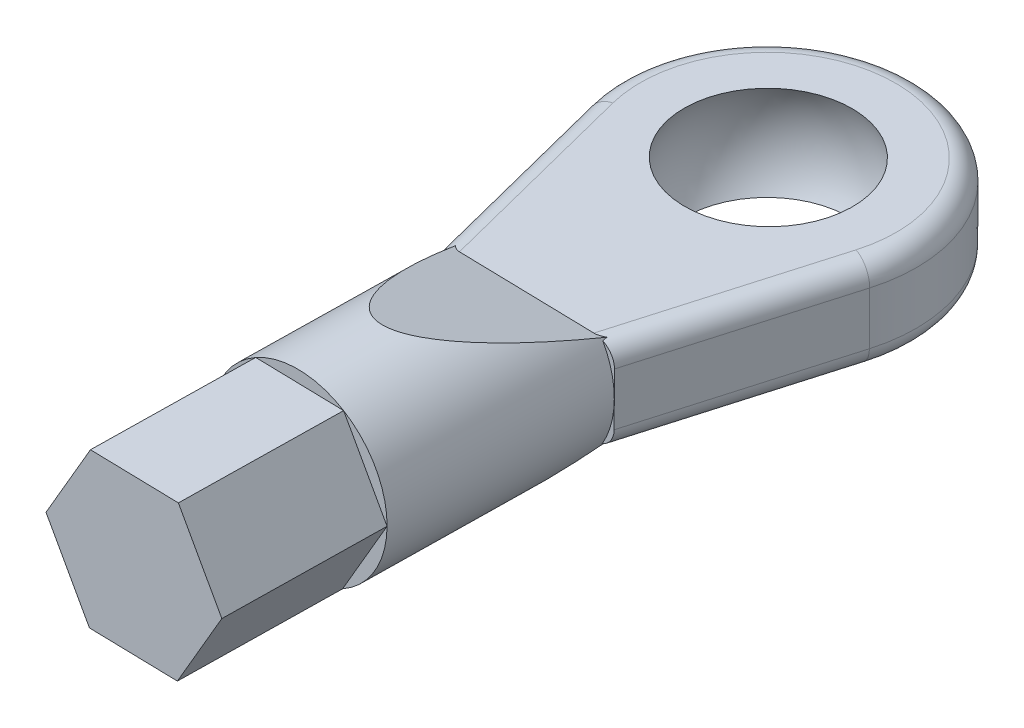
ISO-10303-21;
HEADER;
FILE_DESCRIPTION(('STEP AP214'),'2;1');
FILE_NAME('part.step','',(''),(''),'','','');
FILE_SCHEMA(('AUTOMOTIVE_DESIGN { 1 0 10303 214 1 1 1 1 }'));
ENDSEC;
DATA;
#1=APPLICATION_CONTEXT('core data for automotive mechanical design processes');
#2=APPLICATION_PROTOCOL_DEFINITION('international standard','automotive_design',2000,#1);
#3=PRODUCT_CONTEXT('',#1,'mechanical');
#4=PRODUCT('Part','Part','',(#3));
#5=PRODUCT_RELATED_PRODUCT_CATEGORY('part','',(#4));
#6=PRODUCT_DEFINITION_FORMATION('','',#4);
#7=PRODUCT_DEFINITION_CONTEXT('part definition',#1,'design');
#8=PRODUCT_DEFINITION('design','',#6,#7);
#9=PRODUCT_DEFINITION_SHAPE('','',#8);
#10=(LENGTH_UNIT() NAMED_UNIT(*) SI_UNIT(.MILLI.,.METRE.));
#11=(NAMED_UNIT(*) PLANE_ANGLE_UNIT() SI_UNIT($,.RADIAN.));
#12=(NAMED_UNIT(*) SI_UNIT($,.STERADIAN.) SOLID_ANGLE_UNIT());
#13=UNCERTAINTY_MEASURE_WITH_UNIT(LENGTH_MEASURE(1.E-05),#10,'distance_accuracy_value','');
#14=(GEOMETRIC_REPRESENTATION_CONTEXT(3) GLOBAL_UNCERTAINTY_ASSIGNED_CONTEXT((#13)) GLOBAL_UNIT_ASSIGNED_CONTEXT((#10,
#11,#12)) REPRESENTATION_CONTEXT('',''));
#15=CARTESIAN_POINT('',(0.,0.,0.));
#16=DIRECTION('',(0.,0.,1.));
#17=DIRECTION('',(1.,0.,0.));
#18=AXIS2_PLACEMENT_3D('',#15,#16,#17);
#19=CARTESIAN_POINT('',(5.67601321239481,0.292668026914246,-41.74833254457));
#20=DIRECTION('',(-0.0165938332906445,0.,0.999862312869488));
#21=DIRECTION('',(0.999840533761555,-0.00660028329978561,0.0165934718419906));
#22=AXIS2_PLACEMENT_3D('',#19,#20,#21);
#23=SPHERICAL_SURFACE('',#22,2.35);
#24=CARTESIAN_POINT('',(5.67601321239481,0.292668026914246,-41.74833254457));
#25=DIRECTION('',(0.00659937452571779,0.999978217892951,0.000109524000729846));
#26=DIRECTION('',(-0.0165938332906445,0.,0.999862312869488));
#27=AXIS2_PLACEMENT_3D('',#24,#25,#26);
#28=SPHERICAL_SURFACE('',#27,2.35);
#29=CARTESIAN_POINT('',(5.66814234326676,-0.899974950577202,-41.7484631704457));
#30=DIRECTION('',(0.00659937452571778,0.999978217892951,0.000109524000729846));
#31=DIRECTION('',(-0.0165938332906445,0.,0.999862312869488));
#32=AXIS2_PLACEMENT_3D('',#29,#30,#31);
#33=CIRCLE('',#32,2.0248557382185);
#34=CARTESIAN_POINT('',(5.63454222470916,-0.899974950577167,-39.7238862288035));
#35=VERTEX_POINT('',#34);
#36=EDGE_CURVE('E11',#35,#35,#33,.T.);
#37=ORIENTED_EDGE('',*,*,#36,.F.);
#38=EDGE_LOOP('',(#37));
#39=FACE_BOUND('',#38,.T.);
#40=CARTESIAN_POINT('',(5.68332090467591,1.39997495057659,-41.748211265244));
#41=DIRECTION('',(-0.00659937452571778,-0.999978217892951,-0.000109524000729846));
#42=DIRECTION('',(0.0165938332906445,0.,-0.999862312869488));
#43=AXIS2_PLACEMENT_3D('',#40,#41,#42);
#44=CIRCLE('',#43,2.07275612644958);
#45=CARTESIAN_POINT('',(5.71771587429038,1.39997495057655,-43.8206819998502));
#46=VERTEX_POINT('',#45);
#47=EDGE_CURVE('E23',#46,#46,#44,.T.);
#48=ORIENTED_EDGE('',*,*,#47,.F.);
#49=EDGE_LOOP('',(#48));
#50=FACE_BOUND('',#49,.T.);
#51=ADVANCED_FACE('F16',(#39,#50),#28,.F.);
#52=CARTESIAN_POINT('',(7.30215232841498,0.888651074211561,-36.0009431763924));
#53=DIRECTION('',(-0.276864289309682,0.00172192621272755,0.960907487885885));
#54=DIRECTION('',(0.960886368703873,-0.00637171168175006,0.276869622258076));
#55=AXIS2_PLACEMENT_3D('',#52,#53,#54);
#56=CYLINDRICAL_SURFACE('',#55,0.5);
#57=CARTESIAN_POINT('',(8.70681232465896,0.879914949832599,-40.8760692234892));
#58=DIRECTION('',(-0.276864289309682,0.00172192621272768,0.960907487885885));
#59=DIRECTION('',(0.960886368703873,-0.00637171168175006,0.276869622258076));
#60=AXIS2_PLACEMENT_3D('',#57,#58,#59);
#61=CIRCLE('',#60,0.5);
#62=CARTESIAN_POINT('',(9.18725550901089,0.876729093991724,-40.7376344123602));
#63=VERTEX_POINT('',#62);
#64=CARTESIAN_POINT('',(8.71011201192182,1.37990405877907,-40.8760144614889));
#65=VERTEX_POINT('',#64);
#66=EDGE_CURVE('E30',#63,#65,#61,.T.);
#67=ORIENTED_EDGE('',*,*,#66,.T.);
#68=DIRECTION('',(-0.276864289309682,0.00172192621272755,0.960907487885885));
#69=VECTOR('',#68,1.);
#70=CARTESIAN_POINT('',(8.71011201192182,1.37990405877907,-40.8760144614889));
#71=LINE('',#70,#69);
#72=CARTESIAN_POINT('',(7.26804135580045,1.38887285453664,-35.8710479669562));
#73=VERTEX_POINT('',#72);
#74=EDGE_CURVE('E35',#65,#73,#71,.T.);
#75=ORIENTED_EDGE('',*,*,#74,.T.);
#76=CARTESIAN_POINT('',(7.7449954020907,0.885896861674479,-37.5379099932917));
#77=DIRECTION('',(-0.0110711108884814,-0.958176932170145,0.285962230304466));
#78=DIRECTION('',(-0.284888453636562,0.27714995585697,0.917620003570676));
#79=AXIS2_PLACEMENT_3D('',#76,#77,#78);
#80=ELLIPSE('',#79,1.81029201509207,0.5);
#81=CARTESIAN_POINT('',(7.48255509610219,1.35500703982954,-35.9762175797527));
#82=VERTEX_POINT('',#81);
#83=EDGE_CURVE('E410',#82,#73,#80,.T.);
#84=ORIENTED_EDGE('',*,*,#83,.F.);
#85=CARTESIAN_POINT('',(7.48993954138252,1.33903256238889,-35.8673653184042));
#86=CARTESIAN_POINT('',(7.48726740145295,1.34469817000786,-35.9008716323121));
#87=CARTESIAN_POINT('',(7.48498054009839,1.34963434623517,-35.9345386995218));
#88=CARTESIAN_POINT('',(7.48301171507585,1.35399382359485,-35.9682897171065));
#89=CARTESIAN_POINT('',(7.4828575905935,1.35433509424292,-35.9709318300696));
#90=CARTESIAN_POINT('',(7.48270539782339,1.35467281177731,-35.9735744624318));
#91=CARTESIAN_POINT('',(7.48255509610407,1.35500703982822,-35.9762175797529));
#92=B_SPLINE_CURVE_WITH_KNOTS('',3,(#85,#86,#87,#88,#89,#90,#91),.UNSPECIFIED.,.F.,.F.,(4,3,4),
(0.,0.000102260513487998,0.000110265718890105),.UNSPECIFIED.);
#93=CARTESIAN_POINT('',(7.48993954138112,1.33903256238959,-35.8673653184039));
#94=VERTEX_POINT('',#93);
#95=EDGE_CURVE('E405',#94,#82,#92,.T.);
#96=ORIENTED_EDGE('',*,*,#95,.F.);
#97=CARTESIAN_POINT('',(7.26474166853759,0.88888374559016,-35.8711027289566));
#98=DIRECTION('',(-0.0165938332906445,0.,0.999862312869488));
#99=DIRECTION('',(-0.999840533761555,0.00660028329978514,-0.0165934718419906));
#100=AXIS2_PLACEMENT_3D('',#97,#98,#99);
#101=ELLIPSE('',#100,0.517936437604785,0.5);
#102=CARTESIAN_POINT('',(7.78259551276691,0.885465218370686,-35.8625083652633));
#103=VERTEX_POINT('',#102);
#104=EDGE_CURVE('E400',#103,#94,#101,.T.);
#105=ORIENTED_EDGE('',*,*,#104,.F.);
#106=DIRECTION('',(-0.276864289309682,0.00172192621272754,0.960907487885885));
#107=VECTOR('',#106,1.);
#108=CARTESIAN_POINT('',(9.18725550901089,0.876729093991724,-40.7376344123602));
#109=LINE('',#108,#107);
#110=EDGE_CURVE('E395',#63,#103,#109,.T.);
#111=ORIENTED_EDGE('',*,*,#110,.F.);
#112=EDGE_LOOP('',(#67,#75,#84,#96,#105,#111));
#113=FACE_BOUND('',#112,.T.);
#114=ADVANCED_FACE('F433',(#113),#56,.T.);
#115=CARTESIAN_POINT('',(5.68002026324176,0.899985841630111,-41.7482085336022));
#116=DIRECTION('',(-0.00659937452571779,-0.999978217892952,-0.000109524000729846));
#117=DIRECTION('',(0.0165938332906444,0.,-0.999862312869487));
#118=AXIS2_PLACEMENT_3D('',#115,#116,#117);
#119=TOROIDAL_SURFACE('',#118,3.15,0.5);
#120=CARTESIAN_POINT('',(2.62595480493346,0.920056733427653,-40.9769878546324));
#121=DIRECTION('',(-0.244825930766338,0.0017219262126936,-0.969565520526857));
#122=DIRECTION('',(-0.969544589939145,0.00637171168175927,0.244831961577689));
#123=AXIS2_PLACEMENT_3D('',#120,#121,#122);
#124=CIRCLE('',#123,0.5);
#125=CARTESIAN_POINT('',(2.14118250996388,0.923242589268533,-40.8545718738436));
#126=VERTEX_POINT('',#125);
#127=CARTESIAN_POINT('',(2.62925449219632,1.42004584237413,-40.9769330926321));
#128=VERTEX_POINT('',#127);
#129=EDGE_CURVE('E391',#126,#128,#124,.T.);
#130=ORIENTED_EDGE('',*,*,#129,.T.);
#131=CARTESIAN_POINT('',(5.68331995050462,1.39997495057659,-41.7481537716018));
#132=DIRECTION('',(-0.00659937452571778,-0.999978217892951,-0.000109524000729846));
#133=DIRECTION('',(0.0165938332906445,0.,-0.999862312869488));
#134=AXIS2_PLACEMENT_3D('',#131,#132,#133);
#135=CIRCLE('',#134,3.15);
#136=EDGE_CURVE('E387',#128,#65,#135,.T.);
#137=ORIENTED_EDGE('',*,*,#136,.T.);
#138=ORIENTED_EDGE('',*,*,#66,.F.);
#139=CARTESIAN_POINT('',(5.68002026324176,0.899985841630111,-41.7482085336022));
#140=DIRECTION('',(-0.00659937452571778,-0.999978217892951,-0.000109524000729846));
#141=DIRECTION('',(0.0165938332906445,0.,-0.999862312869488));
#142=AXIS2_PLACEMENT_3D('',#139,#140,#141);
#143=CIRCLE('',#142,3.65);
#144=EDGE_CURVE('E382',#126,#63,#143,.T.);
#145=ORIENTED_EDGE('',*,*,#144,.F.);
#146=EDGE_LOOP('',(#130,#137,#138,#145));
#147=FACE_BOUND('',#146,.T.);
#148=ADVANCED_FACE('F439',(#147),#119,.T.);
#149=CARTESIAN_POINT('',(3.86806945918564,0.911320609048863,-36.0579356221569));
#150=DIRECTION('',(-0.244825930766338,0.00172192621269372,-0.969565520526856));
#151=DIRECTION('',(-0.969544589939145,0.00637171168175927,0.244831961577689));
#152=AXIS2_PLACEMENT_3D('',#149,#150,#151);
#153=CYLINDRICAL_SURFACE('',#152,0.5);
#154=CARTESIAN_POINT('',(3.47647158296111,0.914074821585891,-37.6087509198274));
#155=DIRECTION('',(-0.0110711108884814,-0.958176932170145,0.285962230304466));
#156=DIRECTION('',(-0.257916553646797,-0.273566717626835,-0.926628459719341));
#157=AXIS2_PLACEMENT_3D('',#154,#155,#156);
#158=ELLIPSE('',#157,1.81029201509208,0.5);
#159=CARTESIAN_POINT('',(3.90445069570826,1.41107704661675,-35.9268705156744));
#160=VERTEX_POINT('',#159);
#161=CARTESIAN_POINT('',(3.69311650007899,1.38002239721538,-36.0391075512199));
#162=VERTEX_POINT('',#161);
#163=EDGE_CURVE('E377',#160,#162,#158,.T.);
#164=ORIENTED_EDGE('',*,*,#163,.F.);
#165=DIRECTION('',(-0.244825930766338,0.00172192621269373,-0.969565520526857));
#166=VECTOR('',#165,1.);
#167=CARTESIAN_POINT('',(3.90445069570826,1.41107704661675,-35.9268705156744));
#168=LINE('',#167,#166);
#169=EDGE_CURVE('E372',#160,#128,#168,.T.);
#170=ORIENTED_EDGE('',*,*,#169,.T.);
#171=ORIENTED_EDGE('',*,*,#129,.F.);
#172=DIRECTION('',(-0.244825930766338,0.00172192621269374,-0.969565520526857));
#173=VECTOR('',#172,1.);
#174=CARTESIAN_POINT('',(3.38329716421607,0.914506464889743,-35.935519641368));
#175=LINE('',#174,#173);
#176=CARTESIAN_POINT('',(3.38329716421607,0.914506464889743,-35.935519641368));
#177=VERTEX_POINT('',#176);
#178=EDGE_CURVE('E367',#177,#126,#175,.T.);
#179=ORIENTED_EDGE('',*,*,#178,.F.);
#180=CARTESIAN_POINT('',(3.9011510084454,0.91108793767027,-35.9269252776747));
#181=DIRECTION('',(-0.0165938332906445,0.,0.999862312869488));
#182=DIRECTION('',(-0.999840533761555,0.00660028329978609,-0.0165934718419906));
#183=AXIS2_PLACEMENT_3D('',#180,#181,#182);
#184=ELLIPSE('',#183,0.517936437604785,0.5);
#185=CARTESIAN_POINT('',(3.6819140283774,1.36417061825947,-35.9305637605453));
#186=VERTEX_POINT('',#185);
#187=EDGE_CURVE('E357',#186,#177,#184,.T.);
#188=ORIENTED_EDGE('',*,*,#187,.F.);
#189=CARTESIAN_POINT('',(3.69311650007914,1.38002239721479,-36.0391075512199));
#190=CARTESIAN_POINT('',(3.6900210413661,1.37578599244682,-36.0054269407498));
#191=CARTESIAN_POINT('',(3.68660958491939,1.37098740320772,-35.9718350945994));
#192=CARTESIAN_POINT('',(3.68281275811528,1.36547775628557,-35.9384103495159));
#193=CARTESIAN_POINT('',(3.68251553313875,1.36504644752125,-35.9357937779457));
#194=CARTESIAN_POINT('',(3.68221596446693,1.36461076195205,-35.9331782349517));
#195=CARTESIAN_POINT('',(3.68191402837867,1.36417061825998,-35.9305637605457));
#196=B_SPLINE_CURVE_WITH_KNOTS('',3,(#189,#190,#191,#192,#193,#194,#195),.UNSPECIFIED.,.F.,.F.,
(4,3,4),(0.,0.000102260513419274,0.000110265718889406),.UNSPECIFIED.);
#197=EDGE_CURVE('E352',#162,#186,#196,.T.);
#198=ORIENTED_EDGE('',*,*,#197,.F.);
#199=EDGE_LOOP('',(#164,#170,#171,#179,#188,#198));
#200=FACE_BOUND('',#199,.T.);
#201=ADVANCED_FACE('F484',(#200),#153,.T.);
#202=CARTESIAN_POINT('',(7.29357314153155,-0.411320609049276,-36.0010855575933));
#203=DIRECTION('',(0.276864289309682,-0.00172192621272755,-0.960907487885885));
#204=DIRECTION('',(-0.960886368703873,0.00637171168175006,-0.276869622258076));
#205=AXIS2_PLACEMENT_3D('',#202,#203,#204);
#206=CYLINDRICAL_SURFACE('',#205,0.5);
#207=CARTESIAN_POINT('',(7.73641621520728,-0.414074821586358,-37.5380523744927));
#208=DIRECTION('',(0.00157590146468368,0.958176932170155,0.286172121618378));
#209=DIRECTION('',(0.288522918388739,0.273566717626803,-0.917559685563475));
#210=AXIS2_PLACEMENT_3D('',#207,#208,#209);
#211=ELLIPSE('',#210,1.81029201509208,0.5);
#212=CARTESIAN_POINT('',(7.2528627943913,-0.911077046617154,-35.871299872158));
#213=VERTEX_POINT('',#212);
#214=CARTESIAN_POINT('',(7.46780497848249,-0.880022397215802,-35.9764623744504));
#215=VERTEX_POINT('',#214);
#216=EDGE_CURVE('E347',#213,#215,#211,.T.);
#217=ORIENTED_EDGE('',*,*,#216,.F.);
#218=DIRECTION('',(0.276864289309682,-0.00172192621272755,-0.960907487885885));
#219=VECTOR('',#218,1.);
#220=CARTESIAN_POINT('',(7.2528627943913,-0.911077046617154,-35.871299872158));
#221=LINE('',#220,#219);
#222=CARTESIAN_POINT('',(8.69493345051267,-0.920045842374715,-40.8762663666905));
#223=VERTEX_POINT('',#222);
#224=EDGE_CURVE('E343',#213,#223,#221,.T.);
#225=ORIENTED_EDGE('',*,*,#224,.T.);
#226=CARTESIAN_POINT('',(8.69823313777553,-0.420056733428239,-40.8762116046902));
#227=DIRECTION('',(-0.276864289309682,0.00172192621272768,0.960907487885885));
#228=DIRECTION('',(0.960886368703873,-0.00637171168175006,0.276869622258076));
#229=AXIS2_PLACEMENT_3D('',#226,#227,#228);
#230=CIRCLE('',#229,0.5);
#231=CARTESIAN_POINT('',(9.17867632212746,-0.423242589269114,-40.7377767935612));
#232=VERTEX_POINT('',#231);
#233=EDGE_CURVE('E339',#223,#232,#230,.T.);
#234=ORIENTED_EDGE('',*,*,#233,.T.);
#235=DIRECTION('',(0.276864289309682,-0.00172192621272754,-0.960907487885885));
#236=VECTOR('',#235,1.);
#237=CARTESIAN_POINT('',(7.77401632588348,-0.414506464890151,-35.8626507464642));
#238=LINE('',#237,#236);
#239=CARTESIAN_POINT('',(7.77401632588348,-0.414506464890151,-35.8626507464642));
#240=VERTEX_POINT('',#239);
#241=EDGE_CURVE('E334',#240,#232,#238,.T.);
#242=ORIENTED_EDGE('',*,*,#241,.F.);
#243=CARTESIAN_POINT('',(7.25616248165416,-0.411087937670678,-35.8712451101576));
#244=DIRECTION('',(-0.0165938332906445,0.,0.999862312869488));
#245=DIRECTION('',(0.999840533761555,-0.00660028329978514,0.0165934718419906));
#246=AXIS2_PLACEMENT_3D('',#243,#244,#245);
#247=ELLIPSE('',#246,0.517936437604785,0.5);
#248=CARTESIAN_POINT('',(7.47539946172336,-0.864170618258273,-35.8676066272869));
#249=VERTEX_POINT('',#248);
#250=EDGE_CURVE('E324',#249,#240,#247,.T.);
#251=ORIENTED_EDGE('',*,*,#250,.F.);
#252=CARTESIAN_POINT('',(7.46780497848234,-0.880022397215201,-35.9764623744504));
#253=CARTESIAN_POINT('',(7.46978110552694,-0.875785992447228,-35.9426975953428));
#254=CARTESIAN_POINT('',(7.47207600175696,-0.87098740320812,-35.909011045888));
#255=CARTESIAN_POINT('',(7.47476160104773,-0.865477756285935,-35.8754787176937));
#256=CARTESIAN_POINT('',(7.47497183639093,-0.865046447521613,-35.8728537242516));
#257=CARTESIAN_POINT('',(7.47518444827007,-0.864610761952382,-35.8702296810485));
#258=CARTESIAN_POINT('',(7.47539946172094,-0.864170618260287,-35.8676066272866));
#259=B_SPLINE_CURVE_WITH_KNOTS('',3,(#252,#253,#254,#255,#256,#257,#258),.UNSPECIFIED.,.F.,.F.,
(4,3,4),(0.,0.000102260513419497,0.000110265718890035),.UNSPECIFIED.);
#260=EDGE_CURVE('E319',#215,#249,#259,.T.);
#261=ORIENTED_EDGE('',*,*,#260,.F.);
#262=EDGE_LOOP('',(#217,#225,#234,#242,#251,#261));
#263=FACE_BOUND('',#262,.T.);
#264=ADVANCED_FACE('F470',(#263),#206,.T.);
#265=CARTESIAN_POINT('',(5.67144107635833,-0.399985841630726,-41.7483509148031));
#266=DIRECTION('',(0.00659937452571779,0.999978217892952,0.000109524000729846));
#267=DIRECTION('',(0.0165938332906444,0.,-0.999862312869487));
#268=AXIS2_PLACEMENT_3D('',#265,#266,#267);
#269=TOROIDAL_SURFACE('',#268,3.15,0.5);
#270=CARTESIAN_POINT('',(2.61737561805002,-0.379914949833185,-40.9771302358334));
#271=DIRECTION('',(-0.244825930766338,0.0017219262126936,-0.969565520526857));
#272=DIRECTION('',(-0.969544589939145,0.00637171168175927,0.244831961577689));
#273=AXIS2_PLACEMENT_3D('',#270,#271,#272);
#274=CIRCLE('',#273,0.5);
#275=CARTESIAN_POINT('',(2.61407593078716,-0.87990405877966,-40.9771849978338));
#276=VERTEX_POINT('',#275);
#277=CARTESIAN_POINT('',(2.13260332308045,-0.376729093992305,-40.8547142550445));
#278=VERTEX_POINT('',#277);
#279=EDGE_CURVE('E315',#276,#278,#274,.T.);
#280=ORIENTED_EDGE('',*,*,#279,.T.);
#281=CARTESIAN_POINT('',(5.67144107635833,-0.399985841630726,-41.7483509148031));
#282=DIRECTION('',(0.00659937452571778,0.999978217892951,0.000109524000729846));
#283=DIRECTION('',(-0.0165938332906445,0.,0.999862312869488));
#284=AXIS2_PLACEMENT_3D('',#281,#282,#283);
#285=CIRCLE('',#284,3.65);
#286=EDGE_CURVE('E310',#232,#278,#285,.T.);
#287=ORIENTED_EDGE('',*,*,#286,.F.);
#288=ORIENTED_EDGE('',*,*,#233,.F.);
#289=CARTESIAN_POINT('',(5.66814138909547,-0.899974950577202,-41.7484056768035));
#290=DIRECTION('',(0.00659937452571778,0.999978217892951,0.000109524000729846));
#291=DIRECTION('',(-0.0165938332906445,0.,0.999862312869488));
#292=AXIS2_PLACEMENT_3D('',#289,#290,#291);
#293=CIRCLE('',#292,3.15);
#294=EDGE_CURVE('E306',#223,#276,#293,.T.);
#295=ORIENTED_EDGE('',*,*,#294,.T.);
#296=EDGE_LOOP('',(#280,#287,#288,#295));
#297=FACE_BOUND('',#296,.T.);
#298=ADVANCED_FACE('F454',(#297),#269,.T.);
#299=CARTESIAN_POINT('',(3.85949027230221,-0.388651074211974,-36.0580780033578));
#300=DIRECTION('',(0.244825930766338,-0.00172192621269372,0.969565520526856));
#301=DIRECTION('',(0.969544589939145,-0.00637171168175927,-0.244831961577689));
#302=AXIS2_PLACEMENT_3D('',#299,#300,#301);
#303=CYLINDRICAL_SURFACE('',#302,0.5);
#304=CARTESIAN_POINT('',(3.89257182156197,-0.388883745590567,-35.9270676588757));
#305=DIRECTION('',(-0.0165938332906445,0.,0.999862312869488));
#306=DIRECTION('',(0.999840533761555,-0.00660028329978609,0.0165934718419906));
#307=AXIS2_PLACEMENT_3D('',#304,#305,#306);
#308=ELLIPSE('',#307,0.517936437604785,0.5);
#309=CARTESIAN_POINT('',(3.37471797733264,-0.385465218371095,-35.935662022569));
#310=VERTEX_POINT('',#309);
#311=CARTESIAN_POINT('',(3.66737394871961,-0.839032562391616,-35.9308050694283));
#312=VERTEX_POINT('',#311);
#313=EDGE_CURVE('E301',#310,#312,#308,.T.);
#314=ORIENTED_EDGE('',*,*,#313,.F.);
#315=DIRECTION('',(0.244825930766338,-0.00172192621269374,0.969565520526857));
#316=VECTOR('',#315,1.);
#317=CARTESIAN_POINT('',(2.13260332308045,-0.376729093992305,-40.8547142550445));
#318=LINE('',#317,#316);
#319=EDGE_CURVE('E296',#278,#310,#318,.T.);
#320=ORIENTED_EDGE('',*,*,#319,.F.);
#321=ORIENTED_EDGE('',*,*,#279,.F.);
#322=DIRECTION('',(0.244825930766338,-0.00172192621269373,0.969565520526857));
#323=VECTOR('',#322,1.);
#324=CARTESIAN_POINT('',(2.61407593078716,-0.87990405877966,-40.9771849978338));
#325=LINE('',#324,#323);
#326=CARTESIAN_POINT('',(3.88927213429911,-0.888872854537044,-35.927122420876));
#327=VERTEX_POINT('',#326);
#328=EDGE_CURVE('E292',#276,#327,#325,.T.);
#329=ORIENTED_EDGE('',*,*,#328,.T.);
#330=CARTESIAN_POINT('',(3.46789239607768,-0.385896861674946,-37.6088933010284));
#331=DIRECTION('',(0.00157590146468368,0.958176932170155,0.286172121618378));
#332=DIRECTION('',(0.25428208889462,-0.277149955856937,0.926568141712139));
#333=AXIS2_PLACEMENT_3D('',#330,#331,#332);
#334=ELLIPSE('',#333,1.81029201509208,0.5);
#335=CARTESIAN_POINT('',(3.67836638245929,-0.855007039829962,-36.0393523459177));
#336=VERTEX_POINT('',#335);
#337=EDGE_CURVE('E282',#336,#327,#334,.T.);
#338=ORIENTED_EDGE('',*,*,#337,.F.);
#339=CARTESIAN_POINT('',(3.66737394871926,-0.839032562390334,-35.9308050694286));
#340=CARTESIAN_POINT('',(3.67115646032284,-0.844698169983959,-35.9642042610267));
#341=CARTESIAN_POINT('',(3.67455923982253,-0.849634346191726,-35.997776902133));
#342=CARTESIAN_POINT('',(3.67764694387362,-0.853993823537046,-36.0314440008117));
#343=CARTESIAN_POINT('',(3.67788865698284,-0.85433509420492,-36.0340795445573));
#344=CARTESIAN_POINT('',(3.67812845667869,-0.854672811758713,-36.0367156715162));
#345=CARTESIAN_POINT('',(3.67836638245743,-0.855007039828639,-36.039352345918));
#346=B_SPLINE_CURVE_WITH_KNOTS('',3,(#339,#340,#341,#342,#343,#344,#345),.UNSPECIFIED.,.F.,.F.,
(4,3,4),(0.,0.000102260513032152,0.00011026571888959),.UNSPECIFIED.);
#347=EDGE_CURVE('E277',#312,#336,#346,.T.);
#348=ORIENTED_EDGE('',*,*,#347,.F.);
#349=EDGE_LOOP('',(#314,#320,#321,#329,#338,#348));
#350=FACE_BOUND('',#349,.T.);
#351=ADVANCED_FACE('F458',(#350),#303,.T.);
#352=CARTESIAN_POINT('',(7.79282454328177,2.43543145610476,-35.8623386030621));
#353=DIRECTION('',(-0.960886368703873,0.00637171168175006,-0.276869622258076));
#354=DIRECTION('',(-0.276864289309682,0.00172192621272768,0.960907487885885));
#355=AXIS2_PLACEMENT_3D('',#352,#353,#354);
#356=PLANE('',#355);
#357=DIRECTION('',(0.00659937452571778,0.999978217892951,0.000109524000729717));
#358=VECTOR('',#357,1.);
#359=CARTESIAN_POINT('',(7.77401632588348,-0.414506464890151,-35.8626507464642));
#360=LINE('',#359,#358);
#361=CARTESIAN_POINT('',(7.77830591932521,0.235479376740268,-35.8625795558637));
#362=VERTEX_POINT('',#361);
#363=EDGE_CURVE('E272',#240,#362,#360,.T.);
#364=ORIENTED_EDGE('',*,*,#363,.F.);
#365=ORIENTED_EDGE('',*,*,#241,.T.);
#366=DIRECTION('',(-0.00659937452571778,-0.999978217892951,-0.000109524000729717));
#367=VECTOR('',#366,1.);
#368=CARTESIAN_POINT('',(9.18725550901089,0.876729093991724,-40.7376344123602));
#369=LINE('',#368,#367);
#370=EDGE_CURVE('E267',#63,#232,#369,.T.);
#371=ORIENTED_EDGE('',*,*,#370,.F.);
#372=ORIENTED_EDGE('',*,*,#110,.T.);
#373=DIRECTION('',(-0.00659937452571778,-0.999978217892951,-0.000109524000729717));
#374=VECTOR('',#373,1.);
#375=CARTESIAN_POINT('',(7.78259551276691,0.885465218370686,-35.8625083652633));
#376=LINE('',#375,#374);
#377=EDGE_CURVE('E263',#103,#362,#376,.T.);
#378=ORIENTED_EDGE('',*,*,#377,.T.);
#379=EDGE_LOOP('',(#364,#365,#371,#372,#378));
#380=FACE_BOUND('',#379,.T.);
#381=ADVANCED_FACE('F468',(#380),#356,.F.);
#382=CARTESIAN_POINT('',(3.39352619473093,2.46447270262382,-35.9353498791669));
#383=DIRECTION('',(0.969544589939146,-0.00637171168175927,-0.244831961577689));
#384=DIRECTION('',(-0.244825930766338,0.0017219262126936,-0.969565520526856));
#385=AXIS2_PLACEMENT_3D('',#382,#383,#384);
#386=PLANE('',#385);
#387=DIRECTION('',(-0.00659937452571778,-0.999978217892951,-0.000109524000729717));
#388=VECTOR('',#387,1.);
#389=CARTESIAN_POINT('',(2.14118250996388,0.923242589268533,-40.8545718738436));
#390=LINE('',#389,#388);
#391=EDGE_CURVE('E258',#126,#278,#390,.T.);
#392=ORIENTED_EDGE('',*,*,#391,.T.);
#393=ORIENTED_EDGE('',*,*,#319,.T.);
#394=DIRECTION('',(-0.00659937452571778,-0.999978217892951,-0.000109524000729717));
#395=VECTOR('',#394,1.);
#396=CARTESIAN_POINT('',(3.37900757077435,0.264520623259325,-35.9355908319685));
#397=LINE('',#396,#395);
#398=CARTESIAN_POINT('',(3.37900757077435,0.264520623259325,-35.9355908319685));
#399=VERTEX_POINT('',#398);
#400=EDGE_CURVE('E253',#399,#310,#397,.T.);
#401=ORIENTED_EDGE('',*,*,#400,.F.);
#402=DIRECTION('',(-0.00659937452571778,-0.999978217892951,-0.000109524000729717));
#403=VECTOR('',#402,1.);
#404=CARTESIAN_POINT('',(3.38329716421607,0.914506464889743,-35.935519641368));
#405=LINE('',#404,#403);
#406=EDGE_CURVE('E248',#177,#399,#405,.T.);
#407=ORIENTED_EDGE('',*,*,#406,.F.);
#408=ORIENTED_EDGE('',*,*,#178,.T.);
#409=EDGE_LOOP('',(#392,#393,#401,#407,#408));
#410=FACE_BOUND('',#409,.T.);
#411=ADVANCED_FACE('F461',(#410),#386,.F.);
#412=CARTESIAN_POINT('',(-2.23179505770182,1.45158446655224,-36.0287083764997));
#413=DIRECTION('',(-0.0110711108884815,-0.958176932170146,0.285962230304466));
#414=DIRECTION('',(0.0140120502105631,-0.286100337150051,-0.958097207767314));
#415=AXIS2_PLACEMENT_3D('',#412,#413,#414);
#416=PLANE('',#415);
#417=DIRECTION('',(0.999840533761555,-0.00660028329978561,0.0165934718419906));
#418=VECTOR('',#417,1.);
#419=CARTESIAN_POINT('',(3.90445069570826,1.41107704661675,-35.9268705156744));
#420=LINE('',#419,#418);
#421=EDGE_CURVE('E243',#160,#73,#420,.T.);
#422=ORIENTED_EDGE('',*,*,#421,.F.);
#423=ORIENTED_EDGE('',*,*,#163,.T.);
#424=CARTESIAN_POINT('',(5.64256719932894,0.249999999999728,-39.750013036377));
#425=DIRECTION('',(-0.0110711108884814,-0.958176932170145,0.285962230304466));
#426=DIRECTION('',(-0.0140120502105631,0.286100337150051,0.958097207767314));
#427=AXIS2_PLACEMENT_3D('',#424,#425,#426);
#428=ELLIPSE('',#427,7.6894424567239,2.2);
#429=EDGE_CURVE('E238',#82,#162,#428,.T.);
#430=ORIENTED_EDGE('',*,*,#429,.F.);
#431=ORIENTED_EDGE('',*,*,#83,.T.);
#432=EDGE_LOOP('',(#422,#423,#430,#431));
#433=FACE_BOUND('',#432,.T.);
#434=ADVANCED_FACE('F491',(#433),#416,.F.);
#435=CARTESIAN_POINT('',(-2.06359147011504,1.45158446655207,-46.1638245471731));
#436=DIRECTION('',(-0.00659937452571779,-0.999978217892952,-0.000109524000729846));
#437=DIRECTION('',(0.0165938332906444,0.,-0.999862312869487));
#438=AXIS2_PLACEMENT_3D('',#435,#436,#437);
#439=PLANE('',#438);
#440=ORIENTED_EDGE('',*,*,#47,.T.);
#441=EDGE_LOOP('',(#440));
#442=FACE_BOUND('',#441,.T.);
#443=ORIENTED_EDGE('',*,*,#421,.T.);
#444=ORIENTED_EDGE('',*,*,#74,.F.);
#445=ORIENTED_EDGE('',*,*,#136,.F.);
#446=ORIENTED_EDGE('',*,*,#169,.F.);
#447=EDGE_LOOP('',(#443,#444,#445,#446));
#448=FACE_BOUND('',#447,.T.);
#449=ADVANCED_FACE('F429',(#442,#448),#439,.F.);
#450=CARTESIAN_POINT('',(-2.0787849047088,-0.848365434601723,-46.1631802678401));
#451=DIRECTION('',(0.00659937452571779,0.999978217892952,0.000109524000729846));
#452=DIRECTION('',(-0.0165938332906444,0.,0.999862312869487));
#453=AXIS2_PLACEMENT_3D('',#450,#451,#452);
#454=PLANE('',#453);
#455=ORIENTED_EDGE('',*,*,#36,.T.);
#456=EDGE_LOOP('',(#455));
#457=FACE_BOUND('',#456,.T.);
#458=ORIENTED_EDGE('',*,*,#294,.F.);
#459=ORIENTED_EDGE('',*,*,#224,.F.);
#460=DIRECTION('',(0.999840533761555,-0.00660028329978561,0.0165934718419906));
#461=VECTOR('',#460,1.);
#462=CARTESIAN_POINT('',(3.88927213429911,-0.888872854537044,-35.927122420876));
#463=LINE('',#462,#461);
#464=EDGE_CURVE('E233',#327,#213,#463,.T.);
#465=ORIENTED_EDGE('',*,*,#464,.F.);
#466=ORIENTED_EDGE('',*,*,#328,.F.);
#467=EDGE_LOOP('',(#458,#459,#465,#466));
#468=FACE_BOUND('',#467,.T.);
#469=ADVANCED_FACE('F442',(#457,#468),#454,.F.);
#470=CARTESIAN_POINT('',(-2.24697361911097,-0.848365434601544,-36.0289602817014));
#471=DIRECTION('',(0.00157590146468368,0.958176932170156,0.286172121618378));
#472=DIRECTION('',(-0.0177882990187932,-0.286100337150016,0.958034536695136));
#473=AXIS2_PLACEMENT_3D('',#470,#471,#472);
#474=PLANE('',#473);
#475=CARTESIAN_POINT('',(5.64256719932894,0.249999999999728,-39.750013036377));
#476=DIRECTION('',(0.00157590146468368,0.958176932170155,0.286172121618378));
#477=DIRECTION('',(-0.0177882990187933,-0.286100337150017,0.958034536695136));
#478=AXIS2_PLACEMENT_3D('',#475,#476,#477);
#479=ELLIPSE('',#478,7.68944245672392,2.2);
#480=EDGE_CURVE('E228',#336,#215,#479,.T.);
#481=ORIENTED_EDGE('',*,*,#480,.F.);
#482=ORIENTED_EDGE('',*,*,#337,.T.);
#483=ORIENTED_EDGE('',*,*,#464,.T.);
#484=ORIENTED_EDGE('',*,*,#216,.T.);
#485=EDGE_LOOP('',(#481,#482,#483,#484));
#486=FACE_BOUND('',#485,.T.);
#487=ADVANCED_FACE('F445',(#486),#474,.F.);
#488=CARTESIAN_POINT('',(5.69024929375662,2.44995207936419,-41.748038771401));
#489=DIRECTION('',(-0.00659937452571779,-0.999978217892952,-0.000109524000729717));
#490=DIRECTION('',(0.0165938332906445,0.,-0.999862312869488));
#491=AXIS2_PLACEMENT_3D('',#488,#489,#490);
#492=CYLINDRICAL_SURFACE('',#491,3.65);
#493=ORIENTED_EDGE('',*,*,#370,.T.);
#494=ORIENTED_EDGE('',*,*,#286,.T.);
#495=ORIENTED_EDGE('',*,*,#391,.F.);
#496=ORIENTED_EDGE('',*,*,#144,.T.);
#497=EDGE_LOOP('',(#493,#494,#495,#496));
#498=FACE_BOUND('',#497,.T.);
#499=ADVANCED_FACE('F464',(#498),#492,.T.);
#500=CARTESIAN_POINT('',(5.87598378685802,0.248037244297906,-35.8941507191379));
#501=DIRECTION('',(-0.0165938332906444,0.,0.999862312869487));
#502=DIRECTION('',(0.999840533761555,-0.00660028329978561,0.0165934718419906));
#503=AXIS2_PLACEMENT_3D('',#500,#501,#502);
#504=PLANE('',#503);
#505=CARTESIAN_POINT('',(5.57865674504978,0.249999999999796,-35.8990851939162));
#506=DIRECTION('',(-0.0165938332906445,0.,0.999862312869488));
#507=DIRECTION('',(0.999840533761555,-0.00660028329978561,0.0165934718419906));
#508=AXIS2_PLACEMENT_3D('',#505,#506,#507);
#509=CIRCLE('',#508,2.2);
#510=EDGE_CURVE('E223',#186,#399,#509,.T.);
#511=ORIENTED_EDGE('',*,*,#510,.F.);
#512=ORIENTED_EDGE('',*,*,#187,.T.);
#513=ORIENTED_EDGE('',*,*,#406,.T.);
#514=EDGE_LOOP('',(#511,#512,#513));
#515=FACE_BOUND('',#514,.T.);
#516=ADVANCED_FACE('F482',(#515),#504,.T.);
#517=ORIENTED_EDGE('',*,*,#400,.T.);
#518=ORIENTED_EDGE('',*,*,#313,.T.);
#519=CARTESIAN_POINT('',(5.57865674504978,0.249999999999796,-35.8990851939162));
#520=DIRECTION('',(-0.0165938332906445,0.,0.999862312869488));
#521=DIRECTION('',(0.999840533761555,-0.00660028329978561,0.0165934718419906));
#522=AXIS2_PLACEMENT_3D('',#519,#520,#521);
#523=CIRCLE('',#522,2.2);
#524=EDGE_CURVE('E218',#399,#312,#523,.T.);
#525=ORIENTED_EDGE('',*,*,#524,.F.);
#526=EDGE_LOOP('',(#517,#518,#525));
#527=FACE_BOUND('',#526,.T.);
#528=ADVANCED_FACE('F479',(#527),#504,.T.);
#529=ORIENTED_EDGE('',*,*,#377,.F.);
#530=ORIENTED_EDGE('',*,*,#104,.T.);
#531=CARTESIAN_POINT('',(5.57865674504978,0.249999999999796,-35.8990851939162));
#532=DIRECTION('',(-0.0165938332906445,0.,0.999862312869488));
#533=DIRECTION('',(0.999840533761555,-0.00660028329978561,0.0165934718419906));
#534=AXIS2_PLACEMENT_3D('',#531,#532,#533);
#535=CIRCLE('',#534,2.2);
#536=EDGE_CURVE('E213',#362,#94,#535,.T.);
#537=ORIENTED_EDGE('',*,*,#536,.F.);
#538=EDGE_LOOP('',(#529,#530,#537));
#539=FACE_BOUND('',#538,.T.);
#540=ADVANCED_FACE('F496',(#539),#504,.T.);
#541=CARTESIAN_POINT('',(5.57865674504978,0.249999999999796,-35.8990851939162));
#542=DIRECTION('',(-0.0165938332906445,0.,0.999862312869488));
#543=DIRECTION('',(0.999840533761555,-0.00660028329978561,0.0165934718419906));
#544=AXIS2_PLACEMENT_3D('',#541,#542,#543);
#545=CIRCLE('',#544,2.2);
#546=EDGE_CURVE('E208',#249,#362,#545,.T.);
#547=ORIENTED_EDGE('',*,*,#546,.F.);
#548=ORIENTED_EDGE('',*,*,#250,.T.);
#549=ORIENTED_EDGE('',*,*,#363,.T.);
#550=EDGE_LOOP('',(#547,#548,#549));
#551=FACE_BOUND('',#550,.T.);
#552=ADVANCED_FACE('F498',(#551),#504,.T.);
#553=CARTESIAN_POINT('',(5.57865674504978,0.249999999999796,-35.8990851939162));
#554=DIRECTION('',(-0.0165938332906444,0.,0.999862312869487));
#555=DIRECTION('',(0.999840533761555,-0.00660028329978561,0.0165934718419906));
#556=AXIS2_PLACEMENT_3D('',#553,#554,#555);
#557=CYLINDRICAL_SURFACE('',#556,2.2);
#558=ORIENTED_EDGE('',*,*,#510,.T.);
#559=ORIENTED_EDGE('',*,*,#524,.T.);
#560=ORIENTED_EDGE('',*,*,#347,.T.);
#561=ORIENTED_EDGE('',*,*,#480,.T.);
#562=ORIENTED_EDGE('',*,*,#260,.T.);
#563=ORIENTED_EDGE('',*,*,#546,.T.);
#564=ORIENTED_EDGE('',*,*,#536,.T.);
#565=ORIENTED_EDGE('',*,*,#95,.T.);
#566=ORIENTED_EDGE('',*,*,#429,.T.);
#567=ORIENTED_EDGE('',*,*,#197,.T.);
#568=EDGE_LOOP('',(#558,#559,#560,#561,#562,#563,#564,#565,#566,#567));
#569=FACE_BOUND('',#568,.T.);
#570=CARTESIAN_POINT('',(5.48739066195124,0.249999999999893,-30.3998424731339));
#571=DIRECTION('',(-0.0165938332906445,0.,0.999862312869488));
#572=DIRECTION('',(0.999840533761555,-0.00660028329978561,0.0165934718419906));
#573=AXIS2_PLACEMENT_3D('',#570,#571,#572);
#574=CIRCLE('',#573,2.2);
#575=CARTESIAN_POINT('',(7.68703983622665,0.235479376740364,-30.3633368350816));
#576=VERTEX_POINT('',#575);
#577=CARTESIAN_POINT('',(6.59978874626333,2.14795407620819,-30.3813809828604));
#578=VERTEX_POINT('',#577);
#579=EDGE_CURVE('E203',#576,#578,#574,.T.);
#580=ORIENTED_EDGE('',*,*,#579,.F.);
#581=CARTESIAN_POINT('',(5.48739066195124,0.249999999999893,-30.3998424731339));
#582=DIRECTION('',(-0.0165938332906445,0.,0.999862312869488));
#583=DIRECTION('',(0.999840533761555,-0.00660028329978561,0.0165934718419906));
#584=AXIS2_PLACEMENT_3D('',#581,#582,#583);
#585=CIRCLE('',#584,2.2);
#586=CARTESIAN_POINT('',(6.57464175191458,-1.66247469946791,-30.381798325355));
#587=VERTEX_POINT('',#586);
#588=EDGE_CURVE('E198',#587,#576,#585,.T.);
#589=ORIENTED_EDGE('',*,*,#588,.F.);
#590=CARTESIAN_POINT('',(5.48739066195124,0.249999999999893,-30.3998424731339));
#591=DIRECTION('',(-0.0165938332906445,0.,0.999862312869488));
#592=DIRECTION('',(0.999840533761555,-0.00660028329978561,0.0165934718419906));
#593=AXIS2_PLACEMENT_3D('',#590,#591,#592);
#594=CIRCLE('',#593,2.2);
#595=CARTESIAN_POINT('',(4.37499257763915,-1.64795407620841,-30.4183039634074));
#596=VERTEX_POINT('',#595);
#597=EDGE_CURVE('E193',#596,#587,#594,.T.);
#598=ORIENTED_EDGE('',*,*,#597,.F.);
#599=CARTESIAN_POINT('',(5.48739066195124,0.249999999999893,-30.3998424731339));
#600=DIRECTION('',(-0.0165938332906445,0.,0.999862312869488));
#601=DIRECTION('',(0.999840533761555,-0.00660028329978561,0.0165934718419906));
#602=AXIS2_PLACEMENT_3D('',#599,#600,#601);
#603=CIRCLE('',#602,2.2);
#604=CARTESIAN_POINT('',(3.28774148767581,0.264520623259408,-30.4363481111864));
#605=VERTEX_POINT('',#604);
#606=EDGE_CURVE('E188',#605,#596,#603,.T.);
#607=ORIENTED_EDGE('',*,*,#606,.F.);
#608=CARTESIAN_POINT('',(5.48739066195124,0.249999999999893,-30.3998424731339));
#609=DIRECTION('',(-0.0165938332906445,0.,0.999862312869488));
#610=DIRECTION('',(0.999840533761555,-0.00660028329978561,0.0165934718419906));
#611=AXIS2_PLACEMENT_3D('',#608,#609,#610);
#612=CIRCLE('',#611,2.2);
#613=CARTESIAN_POINT('',(4.4001395719879,2.1624746994677,-30.4178866209128));
#614=VERTEX_POINT('',#613);
#615=EDGE_CURVE('E175',#614,#605,#612,.T.);
#616=ORIENTED_EDGE('',*,*,#615,.F.);
#617=CARTESIAN_POINT('',(5.48739066195124,0.249999999999893,-30.3998424731339));
#618=DIRECTION('',(-0.0165938332906445,0.,0.999862312869488));
#619=DIRECTION('',(0.999840533761555,-0.00660028329978561,0.0165934718419906));
#620=AXIS2_PLACEMENT_3D('',#617,#618,#619);
#621=CIRCLE('',#620,2.2);
#622=EDGE_CURVE('E171',#578,#614,#621,.T.);
#623=ORIENTED_EDGE('',*,*,#622,.F.);
#624=EDGE_LOOP('',(#580,#589,#598,#607,#616,#623));
#625=FACE_BOUND('',#624,.T.);
#626=ADVANCED_FACE('F475',(#569,#625),#557,.T.);
#627=CARTESIAN_POINT('',(3.23588477846981,2.46447270262398,-26.4366579069068));
#628=DIRECTION('',(0.0165938332906444,0.,-0.999862312869487));
#629=DIRECTION('',(-0.999840533761555,0.00660028329978561,-0.0165934718419906));
#630=AXIS2_PLACEMENT_3D('',#627,#628,#629);
#631=PLANE('',#630);
#632=DIRECTION('',(0.505635492869136,0.862706398276494,0.00839158648795133));
#633=VECTOR('',#632,1.);
#634=CARTESIAN_POINT('',(6.508266418752,-1.66247469946783,-26.3823490738771));
#635=LINE('',#634,#633);
#636=CARTESIAN_POINT('',(6.508266418752,-1.66247469946783,-26.3823490738771));
#637=VERTEX_POINT('',#636);
#638=CARTESIAN_POINT('',(7.62066450306408,0.235479376740436,-26.3638875836036));
#639=VERTEX_POINT('',#638);
#640=EDGE_CURVE('E148',#637,#639,#635,.T.);
#641=ORIENTED_EDGE('',*,*,#640,.T.);
#642=DIRECTION('',(-0.494205040892418,0.869306681576279,-0.00820188535403927));
#643=VECTOR('',#642,1.);
#644=CARTESIAN_POINT('',(7.62066450306407,0.235479376740435,-26.3638875836036));
#645=LINE('',#644,#643);
#646=CARTESIAN_POINT('',(6.53341341310075,2.14795407620826,-26.3819317313825));
#647=VERTEX_POINT('',#646);
#648=EDGE_CURVE('E172',#639,#647,#645,.T.);
#649=ORIENTED_EDGE('',*,*,#648,.T.);
#650=DIRECTION('',(-0.999840533761555,0.00660028329978208,-0.0165934718419906));
#651=VECTOR('',#650,1.);
#652=CARTESIAN_POINT('',(6.53341341310075,2.14795407620826,-26.3819317313825));
#653=LINE('',#652,#651);
#654=CARTESIAN_POINT('',(4.33376423882533,2.16247469946778,-26.4184373694349));
#655=VERTEX_POINT('',#654);
#656=EDGE_CURVE('E177',#647,#655,#653,.T.);
#657=ORIENTED_EDGE('',*,*,#656,.T.);
#658=DIRECTION('',(-0.505635492869136,-0.862706398276494,-0.00839158648795133));
#659=VECTOR('',#658,1.);
#660=CARTESIAN_POINT('',(4.33376423882533,2.16247469946778,-26.4184373694349));
#661=LINE('',#660,#659);
#662=CARTESIAN_POINT('',(3.22136615451323,0.264520623259477,-26.4368988597084));
#663=VERTEX_POINT('',#662);
#664=EDGE_CURVE('E769',#655,#663,#661,.T.);
#665=ORIENTED_EDGE('',*,*,#664,.T.);
#666=DIRECTION('',(0.494205040892425,-0.869306681576275,0.00820188535403939));
#667=VECTOR('',#666,1.);
#668=CARTESIAN_POINT('',(3.22136615451323,0.264520623259477,-26.4368988597084));
#669=LINE('',#668,#667);
#670=CARTESIAN_POINT('',(4.30861724447657,-1.64795407620834,-26.4188547119295));
#671=VERTEX_POINT('',#670);
#672=EDGE_CURVE('E151',#663,#671,#669,.T.);
#673=ORIENTED_EDGE('',*,*,#672,.T.);
#674=DIRECTION('',(0.999840533761555,-0.00660028329977514,0.0165934718419906));
#675=VECTOR('',#674,1.);
#676=CARTESIAN_POINT('',(4.30861724447657,-1.64795407620834,-26.4188547119295));
#677=LINE('',#676,#675);
#678=EDGE_CURVE('E144',#671,#637,#677,.T.);
#679=ORIENTED_EDGE('',*,*,#678,.T.);
#680=EDGE_LOOP('',(#641,#649,#657,#665,#673,#679));
#681=FACE_BOUND('',#680,.T.);
#682=ADVANCED_FACE('F146',(#681),#631,.F.);
#683=CARTESIAN_POINT('',(7.68703983622665,0.235479376740364,-30.3633368350816));
#684=DIRECTION('',(0.869186989233758,0.494273095936687,0.0144251301525105));
#685=DIRECTION('',(0.0165938332906444,0.,-0.999862312869487));
#686=AXIS2_PLACEMENT_3D('',#683,#684,#685);
#687=PLANE('',#686);
#688=ORIENTED_EDGE('',*,*,#648,.F.);
#689=DIRECTION('',(-0.0165938332906445,0.,0.999862312869488));
#690=VECTOR('',#689,1.);
#691=CARTESIAN_POINT('',(7.68703983622665,0.235479376740364,-30.3633368350816));
#692=LINE('',#691,#690);
#693=EDGE_CURVE('E155',#576,#639,#692,.T.);
#694=ORIENTED_EDGE('',*,*,#693,.F.);
#695=DIRECTION('',(-0.494205040892418,0.869306681576279,-0.00820188535403927));
#696=VECTOR('',#695,1.);
#697=CARTESIAN_POINT('',(7.68703983622665,0.235479376740364,-30.3633368350816));
#698=LINE('',#697,#696);
#699=EDGE_CURVE('E751',#576,#578,#698,.T.);
#700=ORIENTED_EDGE('',*,*,#699,.T.);
#701=DIRECTION('',(-0.0165938332906445,0.,0.999862312869488));
#702=VECTOR('',#701,1.);
#703=CARTESIAN_POINT('',(6.59978874626333,2.14795407620819,-30.3813809828604));
#704=LINE('',#703,#702);
#705=EDGE_CURVE('E754',#578,#647,#704,.T.);
#706=ORIENTED_EDGE('',*,*,#705,.T.);
#707=EDGE_LOOP('',(#688,#694,#700,#706));
#708=FACE_BOUND('',#707,.T.);
#709=ADVANCED_FACE('F635',(#708),#687,.T.);
#710=CARTESIAN_POINT('',(6.59978874626333,2.14795407620819,-30.3813809828604));
#711=DIRECTION('',(0.00659937452571424,0.999978217892952,0.000109524000729658));
#712=DIRECTION('',(-0.0165938332906444,0.,0.999862312869487));
#713=AXIS2_PLACEMENT_3D('',#710,#711,#712);
#714=PLANE('',#713);
#715=ORIENTED_EDGE('',*,*,#656,.F.);
#716=ORIENTED_EDGE('',*,*,#705,.F.);
#717=DIRECTION('',(-0.999840533761555,0.00660028329978208,-0.0165934718419906));
#718=VECTOR('',#717,1.);
#719=CARTESIAN_POINT('',(6.59978874626333,2.14795407620819,-30.3813809828604));
#720=LINE('',#719,#718);
#721=EDGE_CURVE('E757',#578,#614,#720,.T.);
#722=ORIENTED_EDGE('',*,*,#721,.T.);
#723=DIRECTION('',(-0.0165938332906445,0.,0.999862312869488));
#724=VECTOR('',#723,1.);
#725=CARTESIAN_POINT('',(4.40013957198791,2.1624746994677,-30.4178866209128));
#726=LINE('',#725,#724);
#727=EDGE_CURVE('E783',#614,#655,#726,.T.);
#728=ORIENTED_EDGE('',*,*,#727,.T.);
#729=EDGE_LOOP('',(#715,#716,#722,#728));
#730=FACE_BOUND('',#729,.T.);
#731=ADVANCED_FACE('F644',(#730),#714,.T.);
#732=CARTESIAN_POINT('',(4.40013957198791,2.1624746994677,-30.4178866209128));
#733=DIRECTION('',(-0.862587614708043,0.505705121956265,-0.0143156061517808));
#734=DIRECTION('',(-0.0165938332906444,0.,0.999862312869487));
#735=AXIS2_PLACEMENT_3D('',#732,#733,#734);
#736=PLANE('',#735);
#737=ORIENTED_EDGE('',*,*,#664,.F.);
#738=ORIENTED_EDGE('',*,*,#727,.F.);
#739=DIRECTION('',(-0.505635492869136,-0.862706398276495,-0.00839158648795133));
#740=VECTOR('',#739,1.);
#741=CARTESIAN_POINT('',(4.40013957198791,2.1624746994677,-30.4178866209128));
#742=LINE('',#741,#740);
#743=EDGE_CURVE('E787',#614,#605,#742,.T.);
#744=ORIENTED_EDGE('',*,*,#743,.T.);
#745=DIRECTION('',(-0.0165938332906445,0.,0.999862312869488));
#746=VECTOR('',#745,1.);
#747=CARTESIAN_POINT('',(3.28774148767581,0.264520623259406,-30.4363481111864));
#748=LINE('',#747,#746);
#749=EDGE_CURVE('E790',#605,#663,#748,.T.);
#750=ORIENTED_EDGE('',*,*,#749,.T.);
#751=EDGE_LOOP('',(#737,#738,#744,#750));
#752=FACE_BOUND('',#751,.T.);
#753=ADVANCED_FACE('F654',(#752),#736,.T.);
#754=CARTESIAN_POINT('',(3.28774148767581,0.264520623259406,-30.4363481111864));
#755=DIRECTION('',(-0.869186989233755,-0.494273095936694,-0.0144251301525104));
#756=DIRECTION('',(-0.0165938332906444,0.,0.999862312869487));
#757=AXIS2_PLACEMENT_3D('',#754,#755,#756);
#758=PLANE('',#757);
#759=ORIENTED_EDGE('',*,*,#672,.F.);
#760=ORIENTED_EDGE('',*,*,#749,.F.);
#761=DIRECTION('',(0.494205040892425,-0.869306681576275,0.00820188535403939));
#762=VECTOR('',#761,1.);
#763=CARTESIAN_POINT('',(3.28774148767581,0.264520623259407,-30.4363481111864));
#764=LINE('',#763,#762);
#765=EDGE_CURVE('E793',#605,#596,#764,.T.);
#766=ORIENTED_EDGE('',*,*,#765,.T.);
#767=DIRECTION('',(-0.0165938332906445,0.,0.999862312869488));
#768=VECTOR('',#767,1.);
#769=CARTESIAN_POINT('',(4.37499257763915,-1.64795407620841,-30.4183039634074));
#770=LINE('',#769,#768);
#771=EDGE_CURVE('E795',#596,#671,#770,.T.);
#772=ORIENTED_EDGE('',*,*,#771,.T.);
#773=EDGE_LOOP('',(#759,#760,#766,#772));
#774=FACE_BOUND('',#773,.T.);
#775=ADVANCED_FACE('F664',(#774),#758,.T.);
#776=CARTESIAN_POINT('',(4.37499257763915,-1.64795407620841,-30.4183039634074));
#777=DIRECTION('',(-0.00659937452570734,-0.999978217892952,-0.000109524000729544));
#778=DIRECTION('',(0.0165938332906444,0.,-0.999862312869487));
#779=AXIS2_PLACEMENT_3D('',#776,#777,#778);
#780=PLANE('',#779);
#781=ORIENTED_EDGE('',*,*,#678,.F.);
#782=ORIENTED_EDGE('',*,*,#771,.F.);
#783=DIRECTION('',(0.999840533761555,-0.00660028329977514,0.0165934718419906));
#784=VECTOR('',#783,1.);
#785=CARTESIAN_POINT('',(4.37499257763915,-1.64795407620841,-30.4183039634074));
#786=LINE('',#785,#784);
#787=EDGE_CURVE('E162',#596,#587,#786,.T.);
#788=ORIENTED_EDGE('',*,*,#787,.T.);
#789=DIRECTION('',(-0.0165938332906445,0.,0.999862312869488));
#790=VECTOR('',#789,1.);
#791=CARTESIAN_POINT('',(6.57464175191458,-1.66247469946791,-30.381798325355));
#792=LINE('',#791,#790);
#793=EDGE_CURVE('E159',#587,#637,#792,.T.);
#794=ORIENTED_EDGE('',*,*,#793,.T.);
#795=EDGE_LOOP('',(#781,#782,#788,#794));
#796=FACE_BOUND('',#795,.T.);
#797=ADVANCED_FACE('F160',(#796),#780,.T.);
#798=CARTESIAN_POINT('',(6.57464175191458,-1.66247469946791,-30.381798325355));
#799=DIRECTION('',(0.862587614708044,-0.505705121956265,0.0143156061517808));
#800=DIRECTION('',(0.0165938332906444,0.,-0.999862312869487));
#801=AXIS2_PLACEMENT_3D('',#798,#799,#800);
#802=PLANE('',#801);
#803=ORIENTED_EDGE('',*,*,#640,.F.);
#804=ORIENTED_EDGE('',*,*,#793,.F.);
#805=DIRECTION('',(0.505635492869136,0.862706398276494,0.00839158648795133));
#806=VECTOR('',#805,1.);
#807=CARTESIAN_POINT('',(6.57464175191458,-1.66247469946791,-30.381798325355));
#808=LINE('',#807,#806);
#809=EDGE_CURVE('E166',#587,#576,#808,.T.);
#810=ORIENTED_EDGE('',*,*,#809,.T.);
#811=ORIENTED_EDGE('',*,*,#693,.T.);
#812=EDGE_LOOP('',(#803,#804,#810,#811));
#813=FACE_BOUND('',#812,.T.);
#814=ADVANCED_FACE('F169',(#813),#802,.T.);
#815=CARTESIAN_POINT('',(5.48739066195124,0.249999999999893,-30.3998424731339));
#816=DIRECTION('',(-0.0165938332906444,0.,0.999862312869487));
#817=DIRECTION('',(0.999840533761555,-0.00660028329978561,0.0165934718419906));
#818=AXIS2_PLACEMENT_3D('',#815,#816,#817);
#819=PLANE('',#818);
#820=ORIENTED_EDGE('',*,*,#809,.F.);
#821=ORIENTED_EDGE('',*,*,#588,.T.);
#822=EDGE_LOOP('',(#820,#821));
#823=FACE_BOUND('',#822,.T.);
#824=ADVANCED_FACE('F691',(#823),#819,.T.);
#825=ORIENTED_EDGE('',*,*,#787,.F.);
#826=ORIENTED_EDGE('',*,*,#597,.T.);
#827=EDGE_LOOP('',(#825,#826));
#828=FACE_BOUND('',#827,.T.);
#829=ADVANCED_FACE('F700',(#828),#819,.T.);
#830=ORIENTED_EDGE('',*,*,#765,.F.);
#831=ORIENTED_EDGE('',*,*,#606,.T.);
#832=EDGE_LOOP('',(#830,#831));
#833=FACE_BOUND('',#832,.T.);
#834=ADVANCED_FACE('F711',(#833),#819,.T.);
#835=ORIENTED_EDGE('',*,*,#743,.F.);
#836=ORIENTED_EDGE('',*,*,#615,.T.);
#837=EDGE_LOOP('',(#835,#836));
#838=FACE_BOUND('',#837,.T.);
#839=ADVANCED_FACE('F720',(#838),#819,.T.);
#840=ORIENTED_EDGE('',*,*,#721,.F.);
#841=ORIENTED_EDGE('',*,*,#622,.T.);
#842=EDGE_LOOP('',(#840,#841));
#843=FACE_BOUND('',#842,.T.);
#844=ADVANCED_FACE('F729',(#843),#819,.T.);
#845=ORIENTED_EDGE('',*,*,#699,.F.);
#846=ORIENTED_EDGE('',*,*,#579,.T.);
#847=EDGE_LOOP('',(#845,#846));
#848=FACE_BOUND('',#847,.T.);
#849=ADVANCED_FACE('F703',(#848),#819,.T.);
#850=CLOSED_SHELL('',(#51,#114,#148,#201,#264,#298,#351,#381,#411,#434,#449,#469,#487,#499,#516,
#528,#540,#552,#626,#682,#709,#731,#753,#775,#797,#814,#824,#829,#834,#839,#844,#849));
#851=MANIFOLD_SOLID_BREP('B1',#850);
#852=ADVANCED_BREP_SHAPE_REPRESENTATION('',(#18,#851),#14);
#853=SHAPE_DEFINITION_REPRESENTATION(#9,#852);
ENDSEC;
END-ISO-10303-21;
